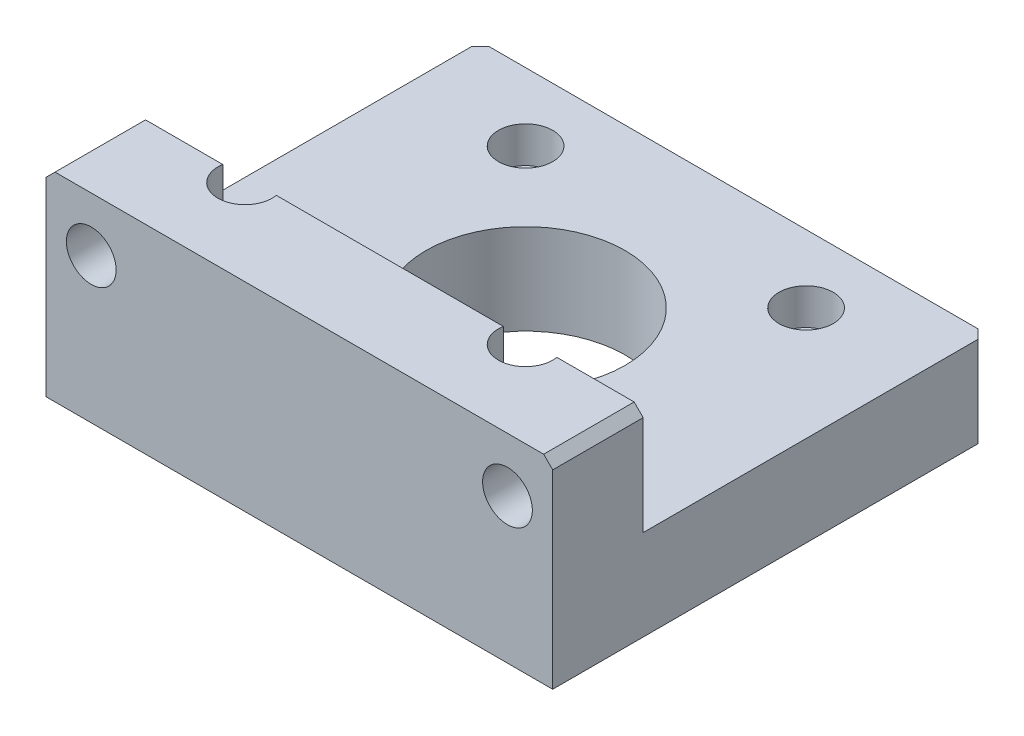
ISO-10303-21;
HEADER;
FILE_DESCRIPTION(('STEP AP214'),'2;1');
FILE_NAME('part.step','',(''),(''),'','','');
FILE_SCHEMA(('AUTOMOTIVE_DESIGN { 1 0 10303 214 1 1 1 1 }'));
ENDSEC;
DATA;
#1=APPLICATION_CONTEXT('core data for automotive mechanical design processes');
#2=APPLICATION_PROTOCOL_DEFINITION('international standard','automotive_design',2000,#1);
#3=PRODUCT_CONTEXT('',#1,'mechanical');
#4=PRODUCT('Part','Part','',(#3));
#5=PRODUCT_RELATED_PRODUCT_CATEGORY('part','',(#4));
#6=PRODUCT_DEFINITION_FORMATION('','',#4);
#7=PRODUCT_DEFINITION_CONTEXT('part definition',#1,'design');
#8=PRODUCT_DEFINITION('design','',#6,#7);
#9=PRODUCT_DEFINITION_SHAPE('','',#8);
#10=(LENGTH_UNIT() NAMED_UNIT(*) SI_UNIT(.MILLI.,.METRE.));
#11=(NAMED_UNIT(*) PLANE_ANGLE_UNIT() SI_UNIT($,.RADIAN.));
#12=(NAMED_UNIT(*) SI_UNIT($,.STERADIAN.) SOLID_ANGLE_UNIT());
#13=UNCERTAINTY_MEASURE_WITH_UNIT(LENGTH_MEASURE(1.E-05),#10,'distance_accuracy_value','');
#14=(GEOMETRIC_REPRESENTATION_CONTEXT(3) GLOBAL_UNCERTAINTY_ASSIGNED_CONTEXT((#13)) GLOBAL_UNIT_ASSIGNED_CONTEXT((#10,
#11,#12)) REPRESENTATION_CONTEXT('',''));
#15=CARTESIAN_POINT('',(0.,0.,0.));
#16=DIRECTION('',(0.,0.,1.));
#17=DIRECTION('',(1.,0.,0.));
#18=AXIS2_PLACEMENT_3D('',#15,#16,#17);
#19=CARTESIAN_POINT('',(43.5,10.,-40.5));
#20=DIRECTION('',(0.,1.,0.));
#21=DIRECTION('',(0.,0.,1.));
#22=AXIS2_PLACEMENT_3D('',#19,#20,#21);
#23=CYLINDRICAL_SURFACE('',#22,1.75);
#24=CARTESIAN_POINT('',(43.5,0.,-40.5));
#25=DIRECTION('',(0.,1.,0.));
#26=DIRECTION('',(0.,0.,1.));
#27=AXIS2_PLACEMENT_3D('',#24,#25,#26);
#28=CIRCLE('',#27,1.74999999999999);
#29=CARTESIAN_POINT('',(43.5,0.,-38.75));
#30=VERTEX_POINT('',#29);
#31=EDGE_CURVE('E363',#30,#30,#28,.T.);
#32=ORIENTED_EDGE('',*,*,#31,.F.);
#33=EDGE_LOOP('',(#32));
#34=FACE_BOUND('',#33,.T.);
#35=CARTESIAN_POINT('',(43.5,6.,-40.5));
#36=DIRECTION('',(0.,1.,0.));
#37=DIRECTION('',(0.,0.,1.));
#38=AXIS2_PLACEMENT_3D('',#35,#36,#37);
#39=CIRCLE('',#38,1.75);
#40=CARTESIAN_POINT('',(43.5,6.,-38.75));
#41=VERTEX_POINT('',#40);
#42=EDGE_CURVE('E283',#41,#41,#39,.F.);
#43=ORIENTED_EDGE('',*,*,#42,.F.);
#44=EDGE_LOOP('',(#43));
#45=FACE_BOUND('',#44,.T.);
#46=ADVANCED_FACE('F34',(#34,#45),#23,.F.);
#47=CARTESIAN_POINT('',(12.5,10.,-40.5));
#48=DIRECTION('',(0.,1.,0.));
#49=DIRECTION('',(0.,0.,1.));
#50=AXIS2_PLACEMENT_3D('',#47,#48,#49);
#51=CYLINDRICAL_SURFACE('',#50,1.75);
#52=CARTESIAN_POINT('',(12.5,0.,-40.5));
#53=DIRECTION('',(0.,1.,0.));
#54=DIRECTION('',(0.,0.,1.));
#55=AXIS2_PLACEMENT_3D('',#52,#53,#54);
#56=CIRCLE('',#55,1.75);
#57=CARTESIAN_POINT('',(12.5,0.,-38.75));
#58=VERTEX_POINT('',#57);
#59=EDGE_CURVE('E200',#58,#58,#56,.T.);
#60=ORIENTED_EDGE('',*,*,#59,.F.);
#61=EDGE_LOOP('',(#60));
#62=FACE_BOUND('',#61,.T.);
#63=CARTESIAN_POINT('',(12.5,6.,-40.5));
#64=DIRECTION('',(0.,1.,0.));
#65=DIRECTION('',(0.,0.,1.));
#66=AXIS2_PLACEMENT_3D('',#63,#64,#65);
#67=CIRCLE('',#66,1.75);
#68=CARTESIAN_POINT('',(12.5,6.,-38.75));
#69=VERTEX_POINT('',#68);
#70=EDGE_CURVE('E328',#69,#69,#67,.F.);
#71=ORIENTED_EDGE('',*,*,#70,.F.);
#72=EDGE_LOOP('',(#71));
#73=FACE_BOUND('',#72,.T.);
#74=ADVANCED_FACE('F371',(#62,#73),#51,.F.);
#75=CARTESIAN_POINT('',(0.,22.,-10.));
#76=DIRECTION('',(0.,0.,1.));
#77=DIRECTION('',(1.,0.,0.));
#78=AXIS2_PLACEMENT_3D('',#75,#76,#77);
#79=PLANE('',#78);
#80=CARTESIAN_POINT('',(51.,16.,-10.));
#81=DIRECTION('',(0.,0.,-1.));
#82=DIRECTION('',(-1.,0.,0.));
#83=AXIS2_PLACEMENT_3D('',#80,#81,#82);
#84=CIRCLE('',#83,2.74999999999999);
#85=CARTESIAN_POINT('',(48.25,16.,-10.));
#86=VERTEX_POINT('',#85);
#87=EDGE_CURVE('E182',#86,#86,#84,.T.);
#88=ORIENTED_EDGE('',*,*,#87,.F.);
#89=EDGE_LOOP('',(#88));
#90=FACE_BOUND('',#89,.T.);
#91=DIRECTION('',(-1.,0.,0.));
#92=VECTOR('',#91,1.);
#93=CARTESIAN_POINT('',(0.,22.,-10.));
#94=LINE('',#93,#92);
#95=CARTESIAN_POINT('',(55.,22.,-10.));
#96=VERTEX_POINT('',#95);
#97=CARTESIAN_POINT('',(46.4580398915498,22.,-10.));
#98=VERTEX_POINT('',#97);
#99=EDGE_CURVE('E134',#96,#98,#94,.T.);
#100=ORIENTED_EDGE('',*,*,#99,.F.);
#101=DIRECTION('',(-0.707106781186543,0.707106781186552,0.));
#102=VECTOR('',#101,1.);
#103=CARTESIAN_POINT('',(55.,22.,-10.));
#104=LINE('',#103,#102);
#105=CARTESIAN_POINT('',(56.,21.,-10.));
#106=VERTEX_POINT('',#105);
#107=EDGE_CURVE('E217',#96,#106,#104,.F.);
#108=ORIENTED_EDGE('',*,*,#107,.T.);
#109=DIRECTION('',(0.,-1.,0.));
#110=VECTOR('',#109,1.);
#111=CARTESIAN_POINT('',(56.,22.,-10.));
#112=LINE('',#111,#110);
#113=CARTESIAN_POINT('',(56.,10.,-10.));
#114=VERTEX_POINT('',#113);
#115=EDGE_CURVE('E213',#106,#114,#112,.T.);
#116=ORIENTED_EDGE('',*,*,#115,.T.);
#117=DIRECTION('',(-1.,0.,0.));
#118=VECTOR('',#117,1.);
#119=CARTESIAN_POINT('',(0.,10.,-10.));
#120=LINE('',#119,#118);
#121=CARTESIAN_POINT('',(46.4580398915498,10.,-10.));
#122=VERTEX_POINT('',#121);
#123=EDGE_CURVE('E160',#114,#122,#120,.T.);
#124=ORIENTED_EDGE('',*,*,#123,.T.);
#125=DIRECTION('',(0.,1.,0.));
#126=VECTOR('',#125,1.);
#127=CARTESIAN_POINT('',(46.4580398915498,6.,-10.));
#128=LINE('',#127,#126);
#129=EDGE_CURVE('E150',#122,#98,#128,.T.);
#130=ORIENTED_EDGE('',*,*,#129,.T.);
#131=EDGE_LOOP('',(#100,#108,#116,#124,#130));
#132=FACE_BOUND('',#131,.T.);
#133=ADVANCED_FACE('F158',(#90,#132),#79,.F.);
#134=CARTESIAN_POINT('',(43.5,10.,-9.50000000000001));
#135=DIRECTION('',(0.,1.,0.));
#136=DIRECTION('',(0.,0.,1.));
#137=AXIS2_PLACEMENT_3D('',#134,#135,#136);
#138=CYLINDRICAL_SURFACE('',#137,1.75);
#139=CARTESIAN_POINT('',(43.5,0.,-9.50000000000001));
#140=DIRECTION('',(0.,1.,0.));
#141=DIRECTION('',(0.,0.,1.));
#142=AXIS2_PLACEMENT_3D('',#139,#140,#141);
#143=CIRCLE('',#142,1.74999999999999);
#144=CARTESIAN_POINT('',(43.5,0.,-7.75000000000001));
#145=VERTEX_POINT('',#144);
#146=EDGE_CURVE('E359',#145,#145,#143,.T.);
#147=ORIENTED_EDGE('',*,*,#146,.F.);
#148=EDGE_LOOP('',(#147));
#149=FACE_BOUND('',#148,.T.);
#150=CARTESIAN_POINT('',(43.5,6.,-9.50000000000001));
#151=DIRECTION('',(0.,1.,0.));
#152=DIRECTION('',(0.,0.,1.));
#153=AXIS2_PLACEMENT_3D('',#150,#151,#152);
#154=CIRCLE('',#153,1.75);
#155=CARTESIAN_POINT('',(43.5,6.,-7.75000000000001));
#156=VERTEX_POINT('',#155);
#157=EDGE_CURVE('E161',#156,#156,#154,.F.);
#158=ORIENTED_EDGE('',*,*,#157,.F.);
#159=EDGE_LOOP('',(#158));
#160=FACE_BOUND('',#159,.T.);
#161=ADVANCED_FACE('F385',(#149,#160),#138,.F.);
#162=CARTESIAN_POINT('',(12.5,10.,-9.5));
#163=DIRECTION('',(0.,1.,0.));
#164=DIRECTION('',(0.,0.,1.));
#165=AXIS2_PLACEMENT_3D('',#162,#163,#164);
#166=CYLINDRICAL_SURFACE('',#165,1.75);
#167=CARTESIAN_POINT('',(12.5,0.,-9.5));
#168=DIRECTION('',(0.,1.,0.));
#169=DIRECTION('',(0.,0.,1.));
#170=AXIS2_PLACEMENT_3D('',#167,#168,#169);
#171=CIRCLE('',#170,1.75);
#172=CARTESIAN_POINT('',(12.5,0.,-7.75));
#173=VERTEX_POINT('',#172);
#174=EDGE_CURVE('E355',#173,#173,#171,.T.);
#175=ORIENTED_EDGE('',*,*,#174,.F.);
#176=EDGE_LOOP('',(#175));
#177=FACE_BOUND('',#176,.T.);
#178=CARTESIAN_POINT('',(12.5,6.,-9.5));
#179=DIRECTION('',(0.,1.,0.));
#180=DIRECTION('',(0.,0.,1.));
#181=AXIS2_PLACEMENT_3D('',#178,#179,#180);
#182=CIRCLE('',#181,1.75);
#183=CARTESIAN_POINT('',(12.5,6.,-7.75));
#184=VERTEX_POINT('',#183);
#185=EDGE_CURVE('E181',#184,#184,#182,.F.);
#186=ORIENTED_EDGE('',*,*,#185,.F.);
#187=EDGE_LOOP('',(#186));
#188=FACE_BOUND('',#187,.T.);
#189=ADVANCED_FACE('F383',(#177,#188),#166,.F.);
#190=CARTESIAN_POINT('',(40.5419601084502,22.,-10.));
#191=VERTEX_POINT('',#190);
#192=CARTESIAN_POINT('',(15.4580398915498,22.,-10.));
#193=VERTEX_POINT('',#192);
#194=EDGE_CURVE('E145',#191,#193,#94,.T.);
#195=ORIENTED_EDGE('',*,*,#194,.F.);
#196=DIRECTION('',(0.,1.,0.));
#197=VECTOR('',#196,1.);
#198=CARTESIAN_POINT('',(40.5419601084502,6.,-10.));
#199=LINE('',#198,#197);
#200=CARTESIAN_POINT('',(40.5419601084502,10.,-10.));
#201=VERTEX_POINT('',#200);
#202=EDGE_CURVE('E153',#191,#201,#199,.F.);
#203=ORIENTED_EDGE('',*,*,#202,.T.);
#204=CARTESIAN_POINT('',(15.4580398915498,10.,-10.));
#205=VERTEX_POINT('',#204);
#206=EDGE_CURVE('E196',#201,#205,#120,.T.);
#207=ORIENTED_EDGE('',*,*,#206,.T.);
#208=DIRECTION('',(0.,1.,0.));
#209=VECTOR('',#208,1.);
#210=CARTESIAN_POINT('',(15.4580398915498,6.,-10.));
#211=LINE('',#210,#209);
#212=EDGE_CURVE('E178',#205,#193,#211,.T.);
#213=ORIENTED_EDGE('',*,*,#212,.T.);
#214=EDGE_LOOP('',(#195,#203,#207,#213));
#215=FACE_BOUND('',#214,.T.);
#216=ADVANCED_FACE('F324',(#215),#79,.F.);
#217=CARTESIAN_POINT('',(0.,10.,0.));
#218=DIRECTION('',(0.,-1.,0.));
#219=DIRECTION('',(0.,0.,-1.));
#220=AXIS2_PLACEMENT_3D('',#217,#218,#219);
#221=PLANE('',#220);
#222=CARTESIAN_POINT('',(43.5,10.,-40.5));
#223=DIRECTION('',(0.,1.,0.));
#224=DIRECTION('',(0.,0.,1.));
#225=AXIS2_PLACEMENT_3D('',#222,#223,#224);
#226=CIRCLE('',#225,3.);
#227=CARTESIAN_POINT('',(43.5,10.,-37.5));
#228=VERTEX_POINT('',#227);
#229=EDGE_CURVE('E340',#228,#228,#226,.T.);
#230=ORIENTED_EDGE('',*,*,#229,.F.);
#231=EDGE_LOOP('',(#230));
#232=FACE_BOUND('',#231,.T.);
#233=CARTESIAN_POINT('',(12.5,10.,-40.5));
#234=DIRECTION('',(0.,1.,0.));
#235=DIRECTION('',(0.,0.,1.));
#236=AXIS2_PLACEMENT_3D('',#233,#234,#235);
#237=CIRCLE('',#236,3.);
#238=CARTESIAN_POINT('',(12.5,10.,-37.5));
#239=VERTEX_POINT('',#238);
#240=EDGE_CURVE('E334',#239,#239,#237,.T.);
#241=ORIENTED_EDGE('',*,*,#240,.F.);
#242=EDGE_LOOP('',(#241));
#243=FACE_BOUND('',#242,.T.);
#244=CARTESIAN_POINT('',(28.,10.,-25.));
#245=DIRECTION('',(0.,1.,0.));
#246=DIRECTION('',(0.,0.,1.));
#247=AXIS2_PLACEMENT_3D('',#244,#245,#246);
#248=CIRCLE('',#247,11.);
#249=CARTESIAN_POINT('',(28.,10.,-14.));
#250=VERTEX_POINT('',#249);
#251=EDGE_CURVE('E353',#250,#250,#248,.T.);
#252=ORIENTED_EDGE('',*,*,#251,.F.);
#253=EDGE_LOOP('',(#252));
#254=FACE_BOUND('',#253,.T.);
#255=DIRECTION('',(0.,0.,-1.));
#256=VECTOR('',#255,1.);
#257=CARTESIAN_POINT('',(56.,10.,0.));
#258=LINE('',#257,#256);
#259=CARTESIAN_POINT('',(56.,10.,-47.));
#260=VERTEX_POINT('',#259);
#261=EDGE_CURVE('E240',#114,#260,#258,.T.);
#262=ORIENTED_EDGE('',*,*,#261,.T.);
#263=DIRECTION('',(0.707106781186543,0.,0.707106781186552));
#264=VECTOR('',#263,1.);
#265=CARTESIAN_POINT('',(55.,10.,-48.));
#266=LINE('',#265,#264);
#267=CARTESIAN_POINT('',(55.,10.,-48.));
#268=VERTEX_POINT('',#267);
#269=EDGE_CURVE('E292',#260,#268,#266,.F.);
#270=ORIENTED_EDGE('',*,*,#269,.T.);
#271=DIRECTION('',(-1.,0.,0.));
#272=VECTOR('',#271,1.);
#273=CARTESIAN_POINT('',(0.,10.,-48.));
#274=LINE('',#273,#272);
#275=CARTESIAN_POINT('',(1.,10.,-48.));
#276=VERTEX_POINT('',#275);
#277=EDGE_CURVE('E250',#268,#276,#274,.T.);
#278=ORIENTED_EDGE('',*,*,#277,.T.);
#279=DIRECTION('',(0.70710678118655,0.,-0.707106781186545));
#280=VECTOR('',#279,1.);
#281=CARTESIAN_POINT('',(0.,10.,-47.));
#282=LINE('',#281,#280);
#283=CARTESIAN_POINT('',(0.,10.,-47.));
#284=VERTEX_POINT('',#283);
#285=EDGE_CURVE('E239',#276,#284,#282,.F.);
#286=ORIENTED_EDGE('',*,*,#285,.T.);
#287=DIRECTION('',(0.,0.,1.));
#288=VECTOR('',#287,1.);
#289=CARTESIAN_POINT('',(0.,10.,0.));
#290=LINE('',#289,#288);
#291=CARTESIAN_POINT('',(0.,10.,-10.));
#292=VERTEX_POINT('',#291);
#293=EDGE_CURVE('E228',#284,#292,#290,.T.);
#294=ORIENTED_EDGE('',*,*,#293,.T.);
#295=CARTESIAN_POINT('',(9.54196010845019,10.,-10.));
#296=VERTEX_POINT('',#295);
#297=EDGE_CURVE('E199',#296,#292,#120,.T.);
#298=ORIENTED_EDGE('',*,*,#297,.F.);
#299=CARTESIAN_POINT('',(12.5,10.,-9.5));
#300=DIRECTION('',(0.,-1.,0.));
#301=DIRECTION('',(0.,0.,-1.));
#302=AXIS2_PLACEMENT_3D('',#299,#300,#301);
#303=CIRCLE('',#302,3.);
#304=EDGE_CURVE('E175',#296,#205,#303,.T.);
#305=ORIENTED_EDGE('',*,*,#304,.T.);
#306=ORIENTED_EDGE('',*,*,#206,.F.);
#307=CARTESIAN_POINT('',(43.5,10.,-9.50000000000001));
#308=DIRECTION('',(0.,-1.,0.));
#309=DIRECTION('',(0.,0.,-1.));
#310=AXIS2_PLACEMENT_3D('',#307,#308,#309);
#311=CIRCLE('',#310,3.);
#312=EDGE_CURVE('E166',#201,#122,#311,.T.);
#313=ORIENTED_EDGE('',*,*,#312,.T.);
#314=ORIENTED_EDGE('',*,*,#123,.F.);
#315=EDGE_LOOP('',(#262,#270,#278,#286,#294,#298,#305,#306,#313,#314));
#316=FACE_BOUND('',#315,.T.);
#317=ADVANCED_FACE('F236',(#232,#243,#254,#316),#221,.F.);
#318=CARTESIAN_POINT('',(0.,10.,0.));
#319=DIRECTION('',(1.,0.,0.));
#320=DIRECTION('',(0.,0.,-1.));
#321=AXIS2_PLACEMENT_3D('',#318,#319,#320);
#322=PLANE('',#321);
#323=DIRECTION('',(0.,-1.,0.));
#324=VECTOR('',#323,1.);
#325=CARTESIAN_POINT('',(0.,10.,0.));
#326=LINE('',#325,#324);
#327=CARTESIAN_POINT('',(0.,21.,0.));
#328=VERTEX_POINT('',#327);
#329=CARTESIAN_POINT('',(0.,0.,0.));
#330=VERTEX_POINT('',#329);
#331=EDGE_CURVE('E245',#328,#330,#326,.T.);
#332=ORIENTED_EDGE('',*,*,#331,.F.);
#333=DIRECTION('',(0.,0.,-1.));
#334=VECTOR('',#333,1.);
#335=CARTESIAN_POINT('',(0.,21.,0.));
#336=LINE('',#335,#334);
#337=CARTESIAN_POINT('',(0.,21.,-10.));
#338=VERTEX_POINT('',#337);
#339=EDGE_CURVE('E42',#328,#338,#336,.T.);
#340=ORIENTED_EDGE('',*,*,#339,.T.);
#341=DIRECTION('',(0.,-1.,0.));
#342=VECTOR('',#341,1.);
#343=CARTESIAN_POINT('',(0.,22.,-10.));
#344=LINE('',#343,#342);
#345=EDGE_CURVE('E144',#338,#292,#344,.T.);
#346=ORIENTED_EDGE('',*,*,#345,.T.);
#347=ORIENTED_EDGE('',*,*,#293,.F.);
#348=DIRECTION('',(0.,-1.,0.));
#349=VECTOR('',#348,1.);
#350=CARTESIAN_POINT('',(0.,10.,-47.));
#351=LINE('',#350,#349);
#352=CARTESIAN_POINT('',(0.,0.,-47.));
#353=VERTEX_POINT('',#352);
#354=EDGE_CURVE('E294',#284,#353,#351,.T.);
#355=ORIENTED_EDGE('',*,*,#354,.T.);
#356=DIRECTION('',(0.,0.,1.));
#357=VECTOR('',#356,1.);
#358=CARTESIAN_POINT('',(0.,0.,0.));
#359=LINE('',#358,#357);
#360=EDGE_CURVE('E260',#353,#330,#359,.T.);
#361=ORIENTED_EDGE('',*,*,#360,.T.);
#362=EDGE_LOOP('',(#332,#340,#346,#347,#355,#361));
#363=FACE_BOUND('',#362,.T.);
#364=ADVANCED_FACE('F226',(#363),#322,.F.);
#365=CARTESIAN_POINT('',(0.,10.,0.));
#366=DIRECTION('',(0.,0.,-1.));
#367=DIRECTION('',(-1.,0.,0.));
#368=AXIS2_PLACEMENT_3D('',#365,#366,#367);
#369=PLANE('',#368);
#370=CARTESIAN_POINT('',(51.,16.,0.));
#371=DIRECTION('',(0.,0.,-1.));
#372=DIRECTION('',(-1.,0.,0.));
#373=AXIS2_PLACEMENT_3D('',#370,#371,#372);
#374=CIRCLE('',#373,2.74999999999999);
#375=CARTESIAN_POINT('',(48.25,16.,0.));
#376=VERTEX_POINT('',#375);
#377=EDGE_CURVE('E185',#376,#376,#374,.T.);
#378=ORIENTED_EDGE('',*,*,#377,.T.);
#379=EDGE_LOOP('',(#378));
#380=FACE_BOUND('',#379,.T.);
#381=CARTESIAN_POINT('',(5.,16.,0.));
#382=DIRECTION('',(0.,0.,-1.));
#383=DIRECTION('',(-1.,0.,0.));
#384=AXIS2_PLACEMENT_3D('',#381,#382,#383);
#385=CIRCLE('',#384,2.74999999999999);
#386=CARTESIAN_POINT('',(2.25000000000002,16.,0.));
#387=VERTEX_POINT('',#386);
#388=EDGE_CURVE('E191',#387,#387,#385,.T.);
#389=ORIENTED_EDGE('',*,*,#388,.T.);
#390=EDGE_LOOP('',(#389));
#391=FACE_BOUND('',#390,.T.);
#392=DIRECTION('',(0.,-1.,0.));
#393=VECTOR('',#392,1.);
#394=CARTESIAN_POINT('',(56.,10.,0.));
#395=LINE('',#394,#393);
#396=CARTESIAN_POINT('',(56.,21.,0.));
#397=VERTEX_POINT('',#396);
#398=CARTESIAN_POINT('',(56.,0.,0.));
#399=VERTEX_POINT('',#398);
#400=EDGE_CURVE('E246',#397,#399,#395,.T.);
#401=ORIENTED_EDGE('',*,*,#400,.F.);
#402=DIRECTION('',(0.707106781186543,-0.707106781186552,0.));
#403=VECTOR('',#402,1.);
#404=CARTESIAN_POINT('',(55.,22.,0.));
#405=LINE('',#404,#403);
#406=CARTESIAN_POINT('',(55.,22.,0.));
#407=VERTEX_POINT('',#406);
#408=EDGE_CURVE('E222',#397,#407,#405,.F.);
#409=ORIENTED_EDGE('',*,*,#408,.T.);
#410=DIRECTION('',(1.,0.,0.));
#411=VECTOR('',#410,1.);
#412=CARTESIAN_POINT('',(0.,22.,0.));
#413=LINE('',#412,#411);
#414=CARTESIAN_POINT('',(0.999999999999994,22.,0.));
#415=VERTEX_POINT('',#414);
#416=EDGE_CURVE('E194',#415,#407,#413,.T.);
#417=ORIENTED_EDGE('',*,*,#416,.F.);
#418=DIRECTION('',(0.707106781186548,0.707106781186548,0.));
#419=VECTOR('',#418,1.);
#420=CARTESIAN_POINT('',(0.999999999999994,22.,0.));
#421=LINE('',#420,#419);
#422=EDGE_CURVE('E56',#415,#328,#421,.F.);
#423=ORIENTED_EDGE('',*,*,#422,.T.);
#424=ORIENTED_EDGE('',*,*,#331,.T.);
#425=DIRECTION('',(1.,0.,0.));
#426=VECTOR('',#425,1.);
#427=CARTESIAN_POINT('',(0.,0.,0.));
#428=LINE('',#427,#426);
#429=EDGE_CURVE('E262',#330,#399,#428,.T.);
#430=ORIENTED_EDGE('',*,*,#429,.T.);
#431=EDGE_LOOP('',(#401,#409,#417,#423,#424,#430));
#432=FACE_BOUND('',#431,.T.);
#433=ADVANCED_FACE('F302',(#380,#391,#432),#369,.F.);
#434=CARTESIAN_POINT('',(56.,10.,0.));
#435=DIRECTION('',(-1.,0.,0.));
#436=DIRECTION('',(0.,0.,1.));
#437=AXIS2_PLACEMENT_3D('',#434,#435,#436);
#438=PLANE('',#437);
#439=ORIENTED_EDGE('',*,*,#115,.F.);
#440=DIRECTION('',(0.,0.,1.));
#441=VECTOR('',#440,1.);
#442=CARTESIAN_POINT('',(56.,21.,0.));
#443=LINE('',#442,#441);
#444=EDGE_CURVE('E219',#106,#397,#443,.T.);
#445=ORIENTED_EDGE('',*,*,#444,.T.);
#446=ORIENTED_EDGE('',*,*,#400,.T.);
#447=DIRECTION('',(0.,0.,-1.));
#448=VECTOR('',#447,1.);
#449=CARTESIAN_POINT('',(56.,0.,0.));
#450=LINE('',#449,#448);
#451=CARTESIAN_POINT('',(56.,0.,-47.));
#452=VERTEX_POINT('',#451);
#453=EDGE_CURVE('E265',#399,#452,#450,.T.);
#454=ORIENTED_EDGE('',*,*,#453,.T.);
#455=DIRECTION('',(0.,1.,0.));
#456=VECTOR('',#455,1.);
#457=CARTESIAN_POINT('',(56.,10.,-47.));
#458=LINE('',#457,#456);
#459=EDGE_CURVE('E289',#452,#260,#458,.T.);
#460=ORIENTED_EDGE('',*,*,#459,.T.);
#461=ORIENTED_EDGE('',*,*,#261,.F.);
#462=EDGE_LOOP('',(#439,#445,#446,#454,#460,#461));
#463=FACE_BOUND('',#462,.T.);
#464=ADVANCED_FACE('F310',(#463),#438,.F.);
#465=CARTESIAN_POINT('',(0.,10.,-48.));
#466=DIRECTION('',(0.,0.,1.));
#467=DIRECTION('',(1.,0.,0.));
#468=AXIS2_PLACEMENT_3D('',#465,#466,#467);
#469=PLANE('',#468);
#470=ORIENTED_EDGE('',*,*,#277,.F.);
#471=DIRECTION('',(0.,-1.,0.));
#472=VECTOR('',#471,1.);
#473=CARTESIAN_POINT('',(55.,10.,-48.));
#474=LINE('',#473,#472);
#475=CARTESIAN_POINT('',(55.,0.,-48.));
#476=VERTEX_POINT('',#475);
#477=EDGE_CURVE('E275',#268,#476,#474,.T.);
#478=ORIENTED_EDGE('',*,*,#477,.T.);
#479=DIRECTION('',(-1.,0.,0.));
#480=VECTOR('',#479,1.);
#481=CARTESIAN_POINT('',(0.,0.,-48.));
#482=LINE('',#481,#480);
#483=CARTESIAN_POINT('',(1.,0.,-48.));
#484=VERTEX_POINT('',#483);
#485=EDGE_CURVE('E241',#476,#484,#482,.T.);
#486=ORIENTED_EDGE('',*,*,#485,.T.);
#487=DIRECTION('',(0.,1.,0.));
#488=VECTOR('',#487,1.);
#489=CARTESIAN_POINT('',(1.,10.,-48.));
#490=LINE('',#489,#488);
#491=EDGE_CURVE('E154',#484,#276,#490,.T.);
#492=ORIENTED_EDGE('',*,*,#491,.T.);
#493=EDGE_LOOP('',(#470,#478,#486,#492));
#494=FACE_BOUND('',#493,.T.);
#495=ADVANCED_FACE('F273',(#494),#469,.F.);
#496=CARTESIAN_POINT('',(0.,0.,0.));
#497=DIRECTION('',(0.,-1.,0.));
#498=DIRECTION('',(0.,0.,-1.));
#499=AXIS2_PLACEMENT_3D('',#496,#497,#498);
#500=PLANE('',#499);
#501=ORIENTED_EDGE('',*,*,#59,.T.);
#502=EDGE_LOOP('',(#501));
#503=FACE_BOUND('',#502,.T.);
#504=ORIENTED_EDGE('',*,*,#31,.T.);
#505=EDGE_LOOP('',(#504));
#506=FACE_BOUND('',#505,.T.);
#507=ORIENTED_EDGE('',*,*,#146,.T.);
#508=EDGE_LOOP('',(#507));
#509=FACE_BOUND('',#508,.T.);
#510=ORIENTED_EDGE('',*,*,#174,.T.);
#511=EDGE_LOOP('',(#510));
#512=FACE_BOUND('',#511,.T.);
#513=CARTESIAN_POINT('',(28.,0.,-25.));
#514=DIRECTION('',(0.,-1.,0.));
#515=DIRECTION('',(0.,0.,-1.));
#516=AXIS2_PLACEMENT_3D('',#513,#514,#515);
#517=CIRCLE('',#516,11.);
#518=CARTESIAN_POINT('',(28.,0.,-14.));
#519=VERTEX_POINT('',#518);
#520=EDGE_CURVE('E263',#519,#519,#517,.F.);
#521=ORIENTED_EDGE('',*,*,#520,.T.);
#522=EDGE_LOOP('',(#521));
#523=FACE_BOUND('',#522,.T.);
#524=ORIENTED_EDGE('',*,*,#485,.F.);
#525=DIRECTION('',(-0.707106781186543,0.,-0.707106781186552));
#526=VECTOR('',#525,1.);
#527=CARTESIAN_POINT('',(51.5000000000004,0.,-51.4999999999997));
#528=LINE('',#527,#526);
#529=EDGE_CURVE('E287',#476,#452,#528,.F.);
#530=ORIENTED_EDGE('',*,*,#529,.T.);
#531=ORIENTED_EDGE('',*,*,#453,.F.);
#532=ORIENTED_EDGE('',*,*,#429,.F.);
#533=ORIENTED_EDGE('',*,*,#360,.F.);
#534=DIRECTION('',(-0.70710678118655,0.,0.707106781186545));
#535=VECTOR('',#534,1.);
#536=CARTESIAN_POINT('',(-23.5,0.,-23.5000000000002));
#537=LINE('',#536,#535);
#538=EDGE_CURVE('E279',#353,#484,#537,.F.);
#539=ORIENTED_EDGE('',*,*,#538,.T.);
#540=EDGE_LOOP('',(#524,#530,#531,#532,#533,#539));
#541=FACE_BOUND('',#540,.T.);
#542=ADVANCED_FACE('F316',(#503,#506,#509,#512,#523,#541),#500,.T.);
#543=CARTESIAN_POINT('',(28.,-31.1126983722081,-25.));
#544=DIRECTION('',(0.,1.,0.));
#545=DIRECTION('',(0.,0.,1.));
#546=AXIS2_PLACEMENT_3D('',#543,#544,#545);
#547=CYLINDRICAL_SURFACE('',#546,11.);
#548=CARTESIAN_POINT('',(28.,10.,-14.));
#549=CARTESIAN_POINT('',(28.,9.89583333333333,-14.));
#550=CARTESIAN_POINT('',(28.,9.79166666666667,-14.));
#551=CARTESIAN_POINT('',(28.,9.58333333333333,-14.));
#552=CARTESIAN_POINT('',(28.,9.47916666666667,-14.));
#553=CARTESIAN_POINT('',(28.,9.27083333333333,-14.));
#554=CARTESIAN_POINT('',(28.,9.16666666666667,-14.));
#555=CARTESIAN_POINT('',(28.,8.95833333333333,-14.));
#556=CARTESIAN_POINT('',(28.,8.85416666666667,-14.));
#557=CARTESIAN_POINT('',(28.,8.64583333333333,-14.));
#558=CARTESIAN_POINT('',(28.,8.54166666666667,-14.));
#559=CARTESIAN_POINT('',(28.,8.33333333333333,-14.));
#560=CARTESIAN_POINT('',(28.,8.22916666666667,-14.));
#561=CARTESIAN_POINT('',(28.,8.02083333333333,-14.));
#562=CARTESIAN_POINT('',(28.,7.91666666666667,-14.));
#563=CARTESIAN_POINT('',(28.,7.70833333333333,-14.));
#564=CARTESIAN_POINT('',(28.,7.60416666666667,-14.));
#565=CARTESIAN_POINT('',(28.,7.39583333333333,-14.));
#566=CARTESIAN_POINT('',(28.,7.29166666666667,-14.));
#567=CARTESIAN_POINT('',(28.,7.08333333333333,-14.));
#568=CARTESIAN_POINT('',(28.,6.97916666666667,-14.));
#569=CARTESIAN_POINT('',(28.,6.77083333333333,-14.));
#570=CARTESIAN_POINT('',(28.,6.66666666666667,-14.));
#571=CARTESIAN_POINT('',(28.,6.45833333333333,-14.));
#572=CARTESIAN_POINT('',(28.,6.35416666666667,-14.));
#573=CARTESIAN_POINT('',(28.,6.14583333333333,-14.));
#574=CARTESIAN_POINT('',(28.,6.04166666666667,-14.));
#575=CARTESIAN_POINT('',(28.,5.83333333333333,-14.));
#576=CARTESIAN_POINT('',(28.,5.72916666666666,-14.));
#577=CARTESIAN_POINT('',(28.,5.52083333333333,-14.));
#578=CARTESIAN_POINT('',(28.,5.41666666666667,-14.));
#579=CARTESIAN_POINT('',(28.,5.20833333333334,-14.));
#580=CARTESIAN_POINT('',(28.,5.10416666666667,-14.));
#581=CARTESIAN_POINT('',(28.,4.89583333333333,-14.));
#582=CARTESIAN_POINT('',(28.,4.79166666666667,-14.));
#583=CARTESIAN_POINT('',(28.,4.58333333333333,-14.));
#584=CARTESIAN_POINT('',(28.,4.47916666666667,-14.));
#585=CARTESIAN_POINT('',(28.,4.27083333333333,-14.));
#586=CARTESIAN_POINT('',(28.,4.16666666666667,-14.));
#587=CARTESIAN_POINT('',(28.,3.95833333333334,-14.));
#588=CARTESIAN_POINT('',(28.,3.85416666666667,-14.));
#589=CARTESIAN_POINT('',(28.,3.64583333333334,-14.));
#590=CARTESIAN_POINT('',(28.,3.54166666666667,-14.));
#591=CARTESIAN_POINT('',(28.,3.33333333333334,-14.));
#592=CARTESIAN_POINT('',(28.,3.22916666666667,-14.));
#593=CARTESIAN_POINT('',(28.,3.02083333333334,-14.));
#594=CARTESIAN_POINT('',(28.,2.91666666666667,-14.));
#595=CARTESIAN_POINT('',(28.,2.70833333333334,-14.));
#596=CARTESIAN_POINT('',(28.,2.60416666666667,-14.));
#597=CARTESIAN_POINT('',(28.,2.39583333333334,-14.));
#598=CARTESIAN_POINT('',(28.,2.29166666666667,-14.));
#599=CARTESIAN_POINT('',(28.,2.08333333333334,-14.));
#600=CARTESIAN_POINT('',(28.,1.97916666666667,-14.));
#601=CARTESIAN_POINT('',(28.,1.77083333333334,-14.));
#602=CARTESIAN_POINT('',(28.,1.66666666666667,-14.));
#603=CARTESIAN_POINT('',(28.,1.45833333333333,-14.));
#604=CARTESIAN_POINT('',(28.,1.35416666666667,-14.));
#605=CARTESIAN_POINT('',(28.,1.14583333333333,-14.));
#606=CARTESIAN_POINT('',(28.,1.04166666666667,-14.));
#607=CARTESIAN_POINT('',(28.,0.833333333333334,-14.));
#608=CARTESIAN_POINT('',(28.,0.729166666666667,-14.));
#609=CARTESIAN_POINT('',(28.,0.520833333333334,-14.));
#610=CARTESIAN_POINT('',(28.,0.416666666666667,-14.));
#611=CARTESIAN_POINT('',(28.,0.208333333333335,-14.));
#612=CARTESIAN_POINT('',(28.,0.104166666666669,-14.));
#613=CARTESIAN_POINT('',(28.,0.,-14.));
#614=B_SPLINE_CURVE_WITH_KNOTS('',3,(#548,#549,#550,#551,#552,#553,#554,#555,#556,#557,#558,
#559,#560,#561,#562,#563,#564,#565,#566,#567,#568,#569,#570,#571,#572,#573,#574,#575,#576,#577,
#578,#579,#580,#581,#582,#583,#584,#585,#586,#587,#588,#589,#590,#591,#592,#593,#594,#595,#596,
#597,#598,#599,#600,#601,#602,#603,#604,#605,#606,#607,#608,#609,#610,#611,#612,#613),
.UNSPECIFIED.,.F.,.F.,(4,2,2,2,2,2,2,2,2,2,2,2,2,2,2,2,2,2,2,2,2,2,2,2,2,2,2,2,2,2,2,2,4),(0.,
0.3125,0.625000000000001,0.937500000000001,1.25,1.5625,1.875,2.1875,2.5,2.8125,3.125,3.4375,
3.75,4.0625,4.375,4.6875,5.,5.3125,5.62500000000001,5.9375,6.25,6.5625,6.875,7.1875,7.5,7.8125,
8.125,8.4375,8.75,9.0625,9.375,9.6875,10.),.UNSPECIFIED.);
#615=EDGE_CURVE('BSEAM405',#250,#519,#614,.T.);
#616=ORIENTED_EDGE('',*,*,#251,.T.);
#617=ORIENTED_EDGE('',*,*,#520,.F.);
#618=ORIENTED_EDGE('',*,*,#615,.T.);
#619=ORIENTED_EDGE('',*,*,#615,.F.);
#620=EDGE_LOOP('',(#616,#618,#617,#619));
#621=FACE_BOUND('',#620,.T.);
#622=ADVANCED_FACE('F405',(#621),#547,.F.);
#623=CARTESIAN_POINT('',(5.,16.,-10.));
#624=DIRECTION('',(0.,0.,-1.));
#625=DIRECTION('',(-1.,0.,0.));
#626=AXIS2_PLACEMENT_3D('',#623,#624,#625);
#627=CIRCLE('',#626,2.74999999999999);
#628=CARTESIAN_POINT('',(2.25000000000001,16.,-10.));
#629=VERTEX_POINT('',#628);
#630=EDGE_CURVE('E188',#629,#629,#627,.T.);
#631=ORIENTED_EDGE('',*,*,#630,.F.);
#632=EDGE_LOOP('',(#631));
#633=FACE_BOUND('',#632,.T.);
#634=ORIENTED_EDGE('',*,*,#345,.F.);
#635=DIRECTION('',(-0.707106781186548,-0.707106781186548,0.));
#636=VECTOR('',#635,1.);
#637=CARTESIAN_POINT('',(0.999999999999994,22.,-10.));
#638=LINE('',#637,#636);
#639=CARTESIAN_POINT('',(0.999999999999994,22.,-10.));
#640=VERTEX_POINT('',#639);
#641=EDGE_CURVE('E11',#338,#640,#638,.F.);
#642=ORIENTED_EDGE('',*,*,#641,.T.);
#643=CARTESIAN_POINT('',(9.54196010845019,22.,-10.));
#644=VERTEX_POINT('',#643);
#645=EDGE_CURVE('E147',#644,#640,#94,.T.);
#646=ORIENTED_EDGE('',*,*,#645,.F.);
#647=DIRECTION('',(0.,1.,0.));
#648=VECTOR('',#647,1.);
#649=CARTESIAN_POINT('',(9.54196010845019,6.,-10.));
#650=LINE('',#649,#648);
#651=EDGE_CURVE('E172',#644,#296,#650,.F.);
#652=ORIENTED_EDGE('',*,*,#651,.T.);
#653=ORIENTED_EDGE('',*,*,#297,.T.);
#654=EDGE_LOOP('',(#634,#642,#646,#652,#653));
#655=FACE_BOUND('',#654,.T.);
#656=ADVANCED_FACE('F243',(#633,#655),#79,.F.);
#657=CARTESIAN_POINT('',(0.,22.,0.));
#658=DIRECTION('',(0.,-1.,0.));
#659=DIRECTION('',(0.,0.,-1.));
#660=AXIS2_PLACEMENT_3D('',#657,#658,#659);
#661=PLANE('',#660);
#662=ORIENTED_EDGE('',*,*,#416,.T.);
#663=DIRECTION('',(0.,0.,-1.));
#664=VECTOR('',#663,1.);
#665=CARTESIAN_POINT('',(55.,22.,0.));
#666=LINE('',#665,#664);
#667=EDGE_CURVE('E141',#407,#96,#666,.T.);
#668=ORIENTED_EDGE('',*,*,#667,.T.);
#669=ORIENTED_EDGE('',*,*,#99,.T.);
#670=CARTESIAN_POINT('',(43.5,22.,-9.50000000000001));
#671=DIRECTION('',(0.,-1.,0.));
#672=DIRECTION('',(0.,0.,-1.));
#673=AXIS2_PLACEMENT_3D('',#670,#671,#672);
#674=CIRCLE('',#673,3.);
#675=EDGE_CURVE('E138',#98,#191,#674,.T.);
#676=ORIENTED_EDGE('',*,*,#675,.T.);
#677=ORIENTED_EDGE('',*,*,#194,.T.);
#678=CARTESIAN_POINT('',(12.5,22.,-9.5));
#679=DIRECTION('',(0.,-1.,0.));
#680=DIRECTION('',(0.,0.,-1.));
#681=AXIS2_PLACEMENT_3D('',#678,#679,#680);
#682=CIRCLE('',#681,3.);
#683=EDGE_CURVE('E155',#193,#644,#682,.T.);
#684=ORIENTED_EDGE('',*,*,#683,.T.);
#685=ORIENTED_EDGE('',*,*,#645,.T.);
#686=DIRECTION('',(0.,0.,1.));
#687=VECTOR('',#686,1.);
#688=CARTESIAN_POINT('',(0.999999999999994,22.,0.));
#689=LINE('',#688,#687);
#690=EDGE_CURVE('E295',#640,#415,#689,.T.);
#691=ORIENTED_EDGE('',*,*,#690,.T.);
#692=EDGE_LOOP('',(#662,#668,#669,#676,#677,#684,#685,#691));
#693=FACE_BOUND('',#692,.T.);
#694=ADVANCED_FACE('F137',(#693),#661,.F.);
#695=CARTESIAN_POINT('',(5.,16.,-10.));
#696=DIRECTION('',(0.,0.,-1.));
#697=DIRECTION('',(-1.,0.,0.));
#698=AXIS2_PLACEMENT_3D('',#695,#696,#697);
#699=CYLINDRICAL_SURFACE('',#698,2.74999999999999);
#700=ORIENTED_EDGE('',*,*,#388,.F.);
#701=EDGE_LOOP('',(#700));
#702=FACE_BOUND('',#701,.T.);
#703=ORIENTED_EDGE('',*,*,#630,.T.);
#704=EDGE_LOOP('',(#703));
#705=FACE_BOUND('',#704,.T.);
#706=ADVANCED_FACE('F409',(#702,#705),#699,.F.);
#707=CARTESIAN_POINT('',(51.,16.,-10.));
#708=DIRECTION('',(0.,0.,-1.));
#709=DIRECTION('',(-1.,0.,0.));
#710=AXIS2_PLACEMENT_3D('',#707,#708,#709);
#711=CYLINDRICAL_SURFACE('',#710,2.74999999999999);
#712=ORIENTED_EDGE('',*,*,#377,.F.);
#713=EDGE_LOOP('',(#712));
#714=FACE_BOUND('',#713,.T.);
#715=ORIENTED_EDGE('',*,*,#87,.T.);
#716=EDGE_LOOP('',(#715));
#717=FACE_BOUND('',#716,.T.);
#718=ADVANCED_FACE('F412',(#714,#717),#711,.F.);
#719=CARTESIAN_POINT('',(12.5,6.,-9.5));
#720=DIRECTION('',(0.,1.,0.));
#721=DIRECTION('',(0.,0.,1.));
#722=AXIS2_PLACEMENT_3D('',#719,#720,#721);
#723=PLANE('',#722);
#724=CARTESIAN_POINT('',(12.5,6.,-9.5));
#725=DIRECTION('',(0.,1.,0.));
#726=DIRECTION('',(0.,0.,1.));
#727=AXIS2_PLACEMENT_3D('',#724,#725,#726);
#728=CIRCLE('',#727,3.);
#729=CARTESIAN_POINT('',(12.5,6.,-6.5));
#730=VERTEX_POINT('',#729);
#731=EDGE_CURVE('E164',#730,#730,#728,.T.);
#732=ORIENTED_EDGE('',*,*,#731,.T.);
#733=EDGE_LOOP('',(#732));
#734=FACE_BOUND('',#733,.T.);
#735=ORIENTED_EDGE('',*,*,#185,.T.);
#736=EDGE_LOOP('',(#735));
#737=FACE_BOUND('',#736,.T.);
#738=ADVANCED_FACE('F381',(#734,#737),#723,.T.);
#739=CARTESIAN_POINT('',(12.5,6.,-9.5));
#740=DIRECTION('',(0.,1.,0.));
#741=DIRECTION('',(0.,0.,1.));
#742=AXIS2_PLACEMENT_3D('',#739,#740,#741);
#743=CYLINDRICAL_SURFACE('',#742,3.);
#744=ORIENTED_EDGE('',*,*,#731,.F.);
#745=EDGE_LOOP('',(#744));
#746=FACE_BOUND('',#745,.T.);
#747=ORIENTED_EDGE('',*,*,#304,.F.);
#748=ORIENTED_EDGE('',*,*,#651,.F.);
#749=ORIENTED_EDGE('',*,*,#683,.F.);
#750=ORIENTED_EDGE('',*,*,#212,.F.);
#751=EDGE_LOOP('',(#747,#748,#749,#750));
#752=FACE_BOUND('',#751,.T.);
#753=ADVANCED_FACE('F323',(#746,#752),#743,.F.);
#754=CARTESIAN_POINT('',(43.5,6.,-9.50000000000001));
#755=DIRECTION('',(0.,1.,0.));
#756=DIRECTION('',(0.,0.,1.));
#757=AXIS2_PLACEMENT_3D('',#754,#755,#756);
#758=PLANE('',#757);
#759=CARTESIAN_POINT('',(43.5,6.,-9.50000000000001));
#760=DIRECTION('',(0.,1.,0.));
#761=DIRECTION('',(0.,0.,1.));
#762=AXIS2_PLACEMENT_3D('',#759,#760,#761);
#763=CIRCLE('',#762,3.);
#764=CARTESIAN_POINT('',(43.5,6.,-6.5));
#765=VERTEX_POINT('',#764);
#766=EDGE_CURVE('E326',#765,#765,#763,.T.);
#767=ORIENTED_EDGE('',*,*,#766,.T.);
#768=EDGE_LOOP('',(#767));
#769=FACE_BOUND('',#768,.T.);
#770=ORIENTED_EDGE('',*,*,#157,.T.);
#771=EDGE_LOOP('',(#770));
#772=FACE_BOUND('',#771,.T.);
#773=ADVANCED_FACE('F419',(#769,#772),#758,.T.);
#774=CARTESIAN_POINT('',(43.5,6.,-9.50000000000001));
#775=DIRECTION('',(0.,1.,0.));
#776=DIRECTION('',(0.,0.,1.));
#777=AXIS2_PLACEMENT_3D('',#774,#775,#776);
#778=CYLINDRICAL_SURFACE('',#777,3.);
#779=ORIENTED_EDGE('',*,*,#766,.F.);
#780=EDGE_LOOP('',(#779));
#781=FACE_BOUND('',#780,.T.);
#782=ORIENTED_EDGE('',*,*,#312,.F.);
#783=ORIENTED_EDGE('',*,*,#202,.F.);
#784=ORIENTED_EDGE('',*,*,#675,.F.);
#785=ORIENTED_EDGE('',*,*,#129,.F.);
#786=EDGE_LOOP('',(#782,#783,#784,#785));
#787=FACE_BOUND('',#786,.T.);
#788=ADVANCED_FACE('F149',(#781,#787),#778,.F.);
#789=CARTESIAN_POINT('',(12.5,6.,-9.5));
#790=DIRECTION('',(0.,1.,0.));
#791=DIRECTION('',(0.,0.,1.));
#792=AXIS2_PLACEMENT_3D('',#789,#790,#791);
#793=PLANE('',#792);
#794=CARTESIAN_POINT('',(12.5,6.,-40.5));
#795=DIRECTION('',(0.,1.,0.));
#796=DIRECTION('',(0.,0.,1.));
#797=AXIS2_PLACEMENT_3D('',#794,#795,#796);
#798=CIRCLE('',#797,3.);
#799=CARTESIAN_POINT('',(12.5,6.,-37.5));
#800=VERTEX_POINT('',#799);
#801=EDGE_CURVE('E331',#800,#800,#798,.F.);
#802=ORIENTED_EDGE('',*,*,#801,.F.);
#803=EDGE_LOOP('',(#802));
#804=FACE_BOUND('',#803,.T.);
#805=ORIENTED_EDGE('',*,*,#70,.T.);
#806=EDGE_LOOP('',(#805));
#807=FACE_BOUND('',#806,.T.);
#808=ADVANCED_FACE('F426',(#804,#807),#793,.T.);
#809=CARTESIAN_POINT('',(12.5,-2.48528137423858,-40.5));
#810=DIRECTION('',(0.,1.,0.));
#811=DIRECTION('',(0.,0.,1.));
#812=AXIS2_PLACEMENT_3D('',#809,#810,#811);
#813=CYLINDRICAL_SURFACE('',#812,3.);
#814=ORIENTED_EDGE('',*,*,#801,.T.);
#815=EDGE_LOOP('',(#814));
#816=FACE_BOUND('',#815,.T.);
#817=ORIENTED_EDGE('',*,*,#240,.T.);
#818=EDGE_LOOP('',(#817));
#819=FACE_BOUND('',#818,.T.);
#820=ADVANCED_FACE('F431',(#816,#819),#813,.F.);
#821=CARTESIAN_POINT('',(12.5,6.,-9.5));
#822=DIRECTION('',(0.,1.,0.));
#823=DIRECTION('',(0.,0.,1.));
#824=AXIS2_PLACEMENT_3D('',#821,#822,#823);
#825=PLANE('',#824);
#826=CARTESIAN_POINT('',(43.5,6.,-40.5));
#827=DIRECTION('',(0.,1.,0.));
#828=DIRECTION('',(0.,0.,1.));
#829=AXIS2_PLACEMENT_3D('',#826,#827,#828);
#830=CIRCLE('',#829,3.);
#831=CARTESIAN_POINT('',(43.5,6.,-37.5));
#832=VERTEX_POINT('',#831);
#833=EDGE_CURVE('E337',#832,#832,#830,.F.);
#834=ORIENTED_EDGE('',*,*,#833,.F.);
#835=EDGE_LOOP('',(#834));
#836=FACE_BOUND('',#835,.T.);
#837=ORIENTED_EDGE('',*,*,#42,.T.);
#838=EDGE_LOOP('',(#837));
#839=FACE_BOUND('',#838,.T.);
#840=ADVANCED_FACE('F434',(#836,#839),#825,.T.);
#841=CARTESIAN_POINT('',(43.5,-2.48528137423858,-40.5));
#842=DIRECTION('',(0.,1.,0.));
#843=DIRECTION('',(0.,0.,1.));
#844=AXIS2_PLACEMENT_3D('',#841,#842,#843);
#845=CYLINDRICAL_SURFACE('',#844,3.);
#846=ORIENTED_EDGE('',*,*,#833,.T.);
#847=EDGE_LOOP('',(#846));
#848=FACE_BOUND('',#847,.T.);
#849=ORIENTED_EDGE('',*,*,#229,.T.);
#850=EDGE_LOOP('',(#849));
#851=FACE_BOUND('',#850,.T.);
#852=ADVANCED_FACE('F344',(#848,#851),#845,.F.);
#853=CARTESIAN_POINT('',(55.,10.,-48.));
#854=DIRECTION('',(-0.707106781186552,0.,0.707106781186542));
#855=DIRECTION('',(0.,-1.,0.));
#856=AXIS2_PLACEMENT_3D('',#853,#854,#855);
#857=PLANE('',#856);
#858=ORIENTED_EDGE('',*,*,#269,.F.);
#859=ORIENTED_EDGE('',*,*,#459,.F.);
#860=ORIENTED_EDGE('',*,*,#529,.F.);
#861=ORIENTED_EDGE('',*,*,#477,.F.);
#862=EDGE_LOOP('',(#858,#859,#860,#861));
#863=FACE_BOUND('',#862,.T.);
#864=ADVANCED_FACE('F314',(#863),#857,.F.);
#865=CARTESIAN_POINT('',(0.,10.,-47.));
#866=DIRECTION('',(0.707106781186545,0.,0.70710678118655));
#867=DIRECTION('',(0.,-1.,0.));
#868=AXIS2_PLACEMENT_3D('',#865,#866,#867);
#869=PLANE('',#868);
#870=ORIENTED_EDGE('',*,*,#285,.F.);
#871=ORIENTED_EDGE('',*,*,#491,.F.);
#872=ORIENTED_EDGE('',*,*,#538,.F.);
#873=ORIENTED_EDGE('',*,*,#354,.F.);
#874=EDGE_LOOP('',(#870,#871,#872,#873));
#875=FACE_BOUND('',#874,.T.);
#876=ADVANCED_FACE('F278',(#875),#869,.F.);
#877=CARTESIAN_POINT('',(55.,22.,0.));
#878=DIRECTION('',(-0.707106781186552,-0.707106781186543,0.));
#879=DIRECTION('',(0.,0.,-1.));
#880=AXIS2_PLACEMENT_3D('',#877,#878,#879);
#881=PLANE('',#880);
#882=ORIENTED_EDGE('',*,*,#408,.F.);
#883=ORIENTED_EDGE('',*,*,#444,.F.);
#884=ORIENTED_EDGE('',*,*,#107,.F.);
#885=ORIENTED_EDGE('',*,*,#667,.F.);
#886=EDGE_LOOP('',(#882,#883,#884,#885));
#887=FACE_BOUND('',#886,.T.);
#888=ADVANCED_FACE('F306',(#887),#881,.F.);
#889=CARTESIAN_POINT('',(0.999999999999994,22.,0.));
#890=DIRECTION('',(0.707106781186547,-0.707106781186547,0.));
#891=DIRECTION('',(0.,0.,1.));
#892=AXIS2_PLACEMENT_3D('',#889,#890,#891);
#893=PLANE('',#892);
#894=ORIENTED_EDGE('',*,*,#641,.F.);
#895=ORIENTED_EDGE('',*,*,#339,.F.);
#896=ORIENTED_EDGE('',*,*,#422,.F.);
#897=ORIENTED_EDGE('',*,*,#690,.F.);
#898=EDGE_LOOP('',(#894,#895,#896,#897));
#899=FACE_BOUND('',#898,.T.);
#900=ADVANCED_FACE('F36',(#899),#893,.F.);
#901=CLOSED_SHELL('',(#46,#74,#133,#161,#189,#216,#317,#364,#433,#464,#495,#542,#622,#656,#694,
#706,#718,#738,#753,#773,#788,#808,#820,#840,#852,#864,#876,#888,#900));
#902=MANIFOLD_SOLID_BREP('B2',#901);
#903=ADVANCED_BREP_SHAPE_REPRESENTATION('',(#18,#902),#14);
#904=SHAPE_DEFINITION_REPRESENTATION(#9,#903);
ENDSEC;
END-ISO-10303-21;
